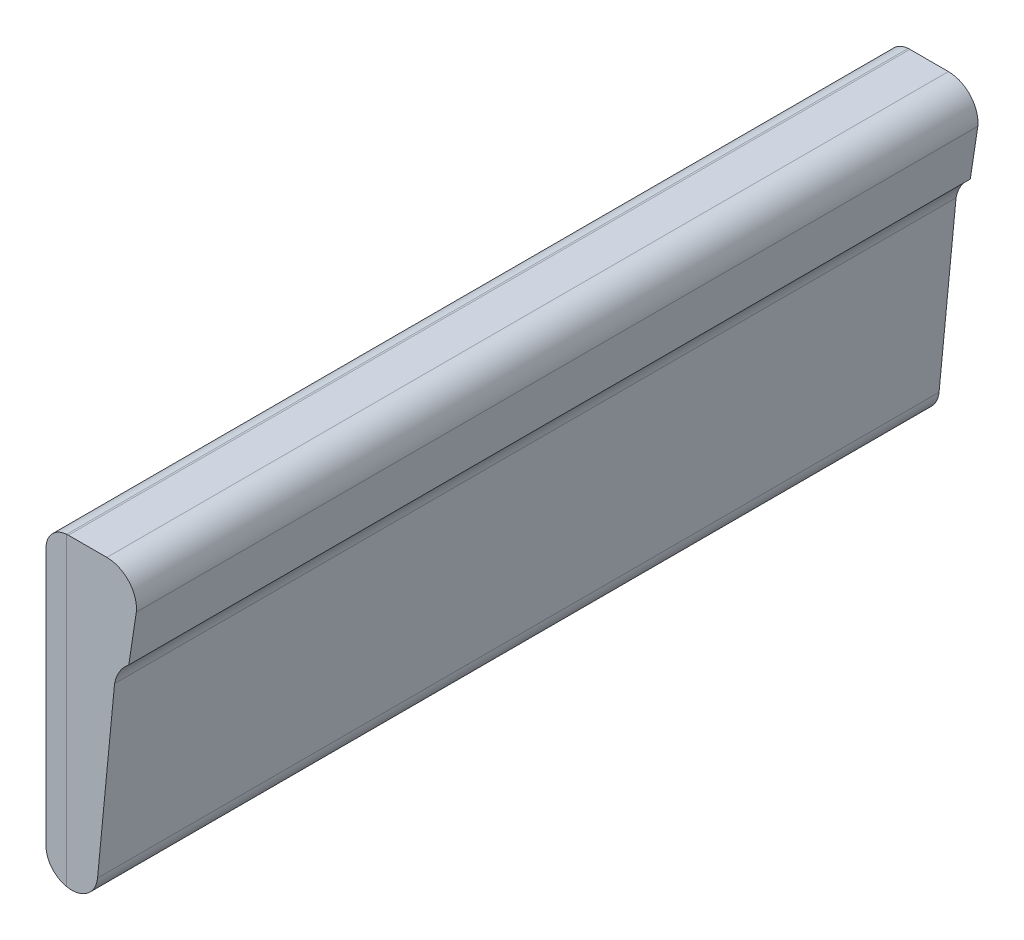
ISO-10303-21;
HEADER;
FILE_DESCRIPTION(('STEP AP214'),'2;1');
FILE_NAME('part.step','',(''),(''),'','','');
FILE_SCHEMA(('AUTOMOTIVE_DESIGN { 1 0 10303 214 1 1 1 1 }'));
ENDSEC;
DATA;
#1=APPLICATION_CONTEXT('core data for automotive mechanical design processes');
#2=APPLICATION_PROTOCOL_DEFINITION('international standard','automotive_design',2000,#1);
#3=PRODUCT_CONTEXT('',#1,'mechanical');
#4=PRODUCT('Part','Part','',(#3));
#5=PRODUCT_RELATED_PRODUCT_CATEGORY('part','',(#4));
#6=PRODUCT_DEFINITION_FORMATION('','',#4);
#7=PRODUCT_DEFINITION_CONTEXT('part definition',#1,'design');
#8=PRODUCT_DEFINITION('design','',#6,#7);
#9=PRODUCT_DEFINITION_SHAPE('','',#8);
#10=(LENGTH_UNIT() NAMED_UNIT(*) SI_UNIT(.MILLI.,.METRE.));
#11=(NAMED_UNIT(*) PLANE_ANGLE_UNIT() SI_UNIT($,.RADIAN.));
#12=(NAMED_UNIT(*) SI_UNIT($,.STERADIAN.) SOLID_ANGLE_UNIT());
#13=UNCERTAINTY_MEASURE_WITH_UNIT(LENGTH_MEASURE(1.E-05),#10,'distance_accuracy_value','');
#14=(GEOMETRIC_REPRESENTATION_CONTEXT(3) GLOBAL_UNCERTAINTY_ASSIGNED_CONTEXT((#13)) GLOBAL_UNIT_ASSIGNED_CONTEXT((#10,
#11,#12)) REPRESENTATION_CONTEXT('',''));
#15=CARTESIAN_POINT('',(0.,0.,0.));
#16=DIRECTION('',(0.,0.,1.));
#17=DIRECTION('',(1.,0.,0.));
#18=AXIS2_PLACEMENT_3D('',#15,#16,#17);
#19=CARTESIAN_POINT('',(-1.6,0.,0.));
#20=DIRECTION('',(-1.,0.,0.));
#21=DIRECTION('',(0.,0.,1.));
#22=AXIS2_PLACEMENT_3D('',#19,#20,#21);
#23=PLANE('',#22);
#24=DIRECTION('',(0.,0.,1.));
#25=VECTOR('',#24,1.);
#26=CARTESIAN_POINT('',(-1.6,-135.507524725737,-319.5));
#27=LINE('',#26,#25);
#28=CARTESIAN_POINT('',(-1.6,-135.507524725737,0.));
#29=VERTEX_POINT('',#28);
#30=CARTESIAN_POINT('',(-1.6,-135.507524725737,-319.5));
#31=VERTEX_POINT('',#30);
#32=EDGE_CURVE('E210',#29,#31,#27,.F.);
#33=ORIENTED_EDGE('',*,*,#32,.T.);
#34=DIRECTION('',(0.,1.,0.));
#35=VECTOR('',#34,1.);
#36=CARTESIAN_POINT('',(-1.6,-31.9738409369276,-319.5));
#37=LINE('',#36,#35);
#38=CARTESIAN_POINT('',(-1.6,-23.5603798711698,-319.5));
#39=VERTEX_POINT('',#38);
#40=EDGE_CURVE('E201',#31,#39,#37,.T.);
#41=ORIENTED_EDGE('',*,*,#40,.T.);
#42=DIRECTION('',(0.,0.,1.));
#43=VECTOR('',#42,1.);
#44=CARTESIAN_POINT('',(-1.6,-23.5603798711698,-319.5));
#45=LINE('',#44,#43);
#46=CARTESIAN_POINT('',(-1.6,-23.5603798711698,0.));
#47=VERTEX_POINT('',#46);
#48=EDGE_CURVE('E207',#39,#47,#45,.T.);
#49=ORIENTED_EDGE('',*,*,#48,.T.);
#50=DIRECTION('',(0.,1.,0.));
#51=VECTOR('',#50,1.);
#52=CARTESIAN_POINT('',(-1.6,-31.9738409369276,0.));
#53=LINE('',#52,#51);
#54=EDGE_CURVE('E172',#29,#47,#53,.T.);
#55=ORIENTED_EDGE('',*,*,#54,.F.);
#56=EDGE_LOOP('',(#33,#41,#49,#55));
#57=FACE_BOUND('',#56,.T.);
#58=DIRECTION('',(0.,1.,0.));
#59=VECTOR('',#58,1.);
#60=CARTESIAN_POINT('',(-1.6,-31.9738409369276,-322.5));
#61=LINE('',#60,#59);
#62=CARTESIAN_POINT('',(-1.6,-138.59646351673,-322.5));
#63=VERTEX_POINT('',#62);
#64=CARTESIAN_POINT('',(-1.6,-20.5461660795298,-322.5));
#65=VERTEX_POINT('',#64);
#66=EDGE_CURVE('E261',#63,#65,#61,.T.);
#67=ORIENTED_EDGE('',*,*,#66,.F.);
#68=DIRECTION('',(0.,0.,1.));
#69=VECTOR('',#68,1.);
#70=CARTESIAN_POINT('',(-1.6,-138.59646351673,-319.5));
#71=LINE('',#70,#69);
#72=CARTESIAN_POINT('',(-1.6,-138.59646351673,3.));
#73=VERTEX_POINT('',#72);
#74=EDGE_CURVE('E266',#73,#63,#71,.F.);
#75=ORIENTED_EDGE('',*,*,#74,.F.);
#76=DIRECTION('',(0.,1.,0.));
#77=VECTOR('',#76,1.);
#78=CARTESIAN_POINT('',(-1.6,-31.9738409369276,3.));
#79=LINE('',#78,#77);
#80=CARTESIAN_POINT('',(-1.6,-20.5461660795298,3.));
#81=VERTEX_POINT('',#80);
#82=EDGE_CURVE('E269',#73,#81,#79,.T.);
#83=ORIENTED_EDGE('',*,*,#82,.T.);
#84=DIRECTION('',(0.,0.,1.));
#85=VECTOR('',#84,1.);
#86=CARTESIAN_POINT('',(-1.6,-20.5461660795298,-319.5));
#87=LINE('',#86,#85);
#88=EDGE_CURVE('E263',#65,#81,#87,.T.);
#89=ORIENTED_EDGE('',*,*,#88,.F.);
#90=EDGE_LOOP('',(#67,#75,#83,#89));
#91=FACE_BOUND('',#90,.T.);
#92=ADVANCED_FACE('F53',(#57,#91),#23,.T.);
#93=CARTESIAN_POINT('',(7.37051113694931,-129.458687531729,-319.5));
#94=DIRECTION('',(0.995409041424573,-0.0957122784715338,0.));
#95=DIRECTION('',(0.0957122784715339,0.995409041424573,0.));
#96=AXIS2_PLACEMENT_3D('',#93,#94,#95);
#97=PLANE('',#96);
#98=DIRECTION('',(0.0957122784715338,0.995409041424573,0.));
#99=VECTOR('',#98,1.);
#100=CARTESIAN_POINT('',(7.37051113694931,-129.458687531729,0.));
#101=LINE('',#100,#99);
#102=CARTESIAN_POINT('',(7.37051113694931,-129.458687531729,0.));
#103=VERTEX_POINT('',#102);
#104=CARTESIAN_POINT('',(13.962836945943,-60.8984064572317,0.));
#105=VERTEX_POINT('',#104);
#106=EDGE_CURVE('E218',#103,#105,#101,.T.);
#107=ORIENTED_EDGE('',*,*,#106,.T.);
#108=DIRECTION('',(0.,0.,1.));
#109=VECTOR('',#108,1.);
#110=CARTESIAN_POINT('',(13.962836945943,-60.8984064572317,-319.5));
#111=LINE('',#110,#109);
#112=CARTESIAN_POINT('',(13.962836945943,-60.8984064572317,-319.5));
#113=VERTEX_POINT('',#112);
#114=EDGE_CURVE('E223',#113,#105,#111,.T.);
#115=ORIENTED_EDGE('',*,*,#114,.F.);
#116=DIRECTION('',(0.0957122784715338,0.995409041424573,0.));
#117=VECTOR('',#116,1.);
#118=CARTESIAN_POINT('',(7.37051113694931,-129.458687531729,-319.5));
#119=LINE('',#118,#117);
#120=CARTESIAN_POINT('',(7.37051113694931,-129.458687531729,-319.5));
#121=VERTEX_POINT('',#120);
#122=EDGE_CURVE('E484',#121,#113,#119,.T.);
#123=ORIENTED_EDGE('',*,*,#122,.F.);
#124=DIRECTION('',(0.,0.,1.));
#125=VECTOR('',#124,1.);
#126=CARTESIAN_POINT('',(7.37051113694931,-129.458687531729,-319.5));
#127=LINE('',#126,#125);
#128=EDGE_CURVE('E205',#121,#103,#127,.T.);
#129=ORIENTED_EDGE('',*,*,#128,.T.);
#130=EDGE_LOOP('',(#107,#115,#123,#129));
#131=FACE_BOUND('',#130,.T.);
#132=ADVANCED_FACE('F304',(#131),#97,.F.);
#133=CARTESIAN_POINT('',(31.4667033179905,-64.0199701793683,-319.5));
#134=DIRECTION('',(0.,0.,1.));
#135=DIRECTION('',(1.,0.,0.));
#136=AXIS2_PLACEMENT_3D('',#133,#134,#135);
#137=CYLINDRICAL_SURFACE('',#136,17.7800308785405);
#138=CARTESIAN_POINT('',(31.4667033179905,-64.0199701793683,0.));
#139=DIRECTION('',(0.,0.,-1.));
#140=DIRECTION('',(1.,0.,0.));
#141=AXIS2_PLACEMENT_3D('',#138,#139,#140);
#142=CIRCLE('',#141,17.7800308785405);
#143=CARTESIAN_POINT('',(19.6303268731132,-50.7523520548891,0.));
#144=VERTEX_POINT('',#143);
#145=EDGE_CURVE('E468',#105,#144,#142,.T.);
#146=ORIENTED_EDGE('',*,*,#145,.T.);
#147=DIRECTION('',(0.,0.,1.));
#148=VECTOR('',#147,1.);
#149=CARTESIAN_POINT('',(19.6303268731132,-50.7523520548891,-319.5));
#150=LINE('',#149,#148);
#151=CARTESIAN_POINT('',(19.6303268731132,-50.7523520548891,-319.5));
#152=VERTEX_POINT('',#151);
#153=EDGE_CURVE('E472',#152,#144,#150,.T.);
#154=ORIENTED_EDGE('',*,*,#153,.F.);
#155=CARTESIAN_POINT('',(31.4667033179905,-64.0199701793683,-319.5));
#156=DIRECTION('',(0.,0.,-1.));
#157=DIRECTION('',(1.,0.,0.));
#158=AXIS2_PLACEMENT_3D('',#155,#156,#157);
#159=CIRCLE('',#158,17.7800308785405);
#160=EDGE_CURVE('E476',#113,#152,#159,.T.);
#161=ORIENTED_EDGE('',*,*,#160,.F.);
#162=ORIENTED_EDGE('',*,*,#114,.T.);
#163=EDGE_LOOP('',(#146,#154,#161,#162));
#164=FACE_BOUND('',#163,.T.);
#165=ADVANCED_FACE('F306',(#164),#137,.T.);
#166=CARTESIAN_POINT('',(22.3782166070811,-32.7853807174074,-319.5));
#167=DIRECTION('',(0.988505756164447,-0.151183233295742,0.));
#168=DIRECTION('',(0.151183233295742,0.988505756164447,0.));
#169=AXIS2_PLACEMENT_3D('',#166,#167,#168);
#170=PLANE('',#169);
#171=DIRECTION('',(0.151183233295742,0.988505756164447,0.));
#172=VECTOR('',#171,1.);
#173=CARTESIAN_POINT('',(22.3782166070811,-32.7853807174074,0.));
#174=LINE('',#173,#172);
#175=CARTESIAN_POINT('',(22.3782166070811,-32.7853807174074,0.));
#176=VERTEX_POINT('',#175);
#177=EDGE_CURVE('E260',#144,#176,#174,.T.);
#178=ORIENTED_EDGE('',*,*,#177,.T.);
#179=DIRECTION('',(0.,0.,1.));
#180=VECTOR('',#179,1.);
#181=CARTESIAN_POINT('',(22.3782166070811,-32.7853807174074,-319.5));
#182=LINE('',#181,#180);
#183=CARTESIAN_POINT('',(22.3782166070811,-32.7853807174074,-319.5));
#184=VERTEX_POINT('',#183);
#185=EDGE_CURVE('E126',#184,#176,#182,.T.);
#186=ORIENTED_EDGE('',*,*,#185,.F.);
#187=DIRECTION('',(0.151183233295742,0.988505756164447,0.));
#188=VECTOR('',#187,1.);
#189=CARTESIAN_POINT('',(22.3782166070811,-32.7853807174074,-319.5));
#190=LINE('',#189,#188);
#191=EDGE_CURVE('E475',#152,#184,#190,.T.);
#192=ORIENTED_EDGE('',*,*,#191,.F.);
#193=ORIENTED_EDGE('',*,*,#153,.T.);
#194=EDGE_LOOP('',(#178,#186,#192,#193));
#195=FACE_BOUND('',#194,.T.);
#196=ADVANCED_FACE('F313',(#195),#170,.F.);
#197=CARTESIAN_POINT('',(13.962836945943,-31.9738409369276,-319.5));
#198=DIRECTION('',(0.,0.,1.));
#199=DIRECTION('',(1.,0.,0.));
#200=AXIS2_PLACEMENT_3D('',#197,#198,#199);
#201=CYLINDRICAL_SURFACE('',#200,8.45441965225271);
#202=CARTESIAN_POINT('',(13.962836945943,-31.9738409369276,0.));
#203=DIRECTION('',(0.,0.,1.));
#204=DIRECTION('',(-1.,0.,0.));
#205=AXIS2_PLACEMENT_3D('',#202,#203,#204);
#206=CIRCLE('',#205,8.45441965225271);
#207=CARTESIAN_POINT('',(13.962836945943,-23.5194212846748,0.));
#208=VERTEX_POINT('',#207);
#209=EDGE_CURVE('E463',#176,#208,#206,.T.);
#210=ORIENTED_EDGE('',*,*,#209,.T.);
#211=DIRECTION('',(0.,0.,1.));
#212=VECTOR('',#211,1.);
#213=CARTESIAN_POINT('',(13.962836945943,-23.5194212846748,-319.5));
#214=LINE('',#213,#212);
#215=CARTESIAN_POINT('',(13.962836945943,-23.5194212846748,-319.5));
#216=VERTEX_POINT('',#215);
#217=EDGE_CURVE('E460',#216,#208,#214,.T.);
#218=ORIENTED_EDGE('',*,*,#217,.F.);
#219=CARTESIAN_POINT('',(13.962836945943,-31.9738409369276,-319.5));
#220=DIRECTION('',(0.,0.,1.));
#221=DIRECTION('',(-1.,0.,0.));
#222=AXIS2_PLACEMENT_3D('',#219,#220,#221);
#223=CIRCLE('',#222,8.45441965225271);
#224=EDGE_CURVE('E257',#184,#216,#223,.T.);
#225=ORIENTED_EDGE('',*,*,#224,.F.);
#226=ORIENTED_EDGE('',*,*,#185,.T.);
#227=EDGE_LOOP('',(#210,#218,#225,#226));
#228=FACE_BOUND('',#227,.T.);
#229=ADVANCED_FACE('F323',(#228),#201,.F.);
#230=CARTESIAN_POINT('',(13.962836945943,-23.5194212846748,-319.5));
#231=DIRECTION('',(0.,1.,0.));
#232=DIRECTION('',(0.,0.,1.));
#233=AXIS2_PLACEMENT_3D('',#230,#231,#232);
#234=PLANE('',#233);
#235=DIRECTION('',(-1.,0.,0.));
#236=VECTOR('',#235,1.);
#237=CARTESIAN_POINT('',(13.962836945943,-23.5194212846748,0.));
#238=LINE('',#237,#236);
#239=CARTESIAN_POINT('',(-0.919188983830335,-23.5194212846748,0.));
#240=VERTEX_POINT('',#239);
#241=EDGE_CURVE('E219',#208,#240,#238,.T.);
#242=ORIENTED_EDGE('',*,*,#241,.T.);
#243=DIRECTION('',(0.,0.,1.));
#244=VECTOR('',#243,1.);
#245=CARTESIAN_POINT('',(-0.919188983830335,-23.5194212846748,-319.5));
#246=LINE('',#245,#244);
#247=CARTESIAN_POINT('',(-0.919188983830335,-23.5194212846748,-319.5));
#248=VERTEX_POINT('',#247);
#249=EDGE_CURVE('E164',#248,#240,#246,.T.);
#250=ORIENTED_EDGE('',*,*,#249,.F.);
#251=DIRECTION('',(-1.,0.,0.));
#252=VECTOR('',#251,1.);
#253=CARTESIAN_POINT('',(13.962836945943,-23.5194212846748,-319.5));
#254=LINE('',#253,#252);
#255=EDGE_CURVE('E204',#216,#248,#254,.T.);
#256=ORIENTED_EDGE('',*,*,#255,.F.);
#257=ORIENTED_EDGE('',*,*,#217,.T.);
#258=EDGE_LOOP('',(#242,#250,#256,#257));
#259=FACE_BOUND('',#258,.T.);
#260=ADVANCED_FACE('F319',(#259),#234,.F.);
#261=CARTESIAN_POINT('',(-0.919188983830335,-29.1980992537325,-319.5));
#262=DIRECTION('',(0.,0.,1.));
#263=DIRECTION('',(1.,0.,0.));
#264=AXIS2_PLACEMENT_3D('',#261,#262,#263);
#265=CYLINDRICAL_SURFACE('',#264,5.67867796905766);
#266=ORIENTED_EDGE('',*,*,#48,.F.);
#267=CARTESIAN_POINT('',(-0.919188983830335,-29.1980992537325,-319.5));
#268=DIRECTION('',(0.,0.,1.));
#269=DIRECTION('',(1.,0.,0.));
#270=AXIS2_PLACEMENT_3D('',#267,#268,#269);
#271=CIRCLE('',#270,5.67867796905766);
#272=EDGE_CURVE('E197',#248,#39,#271,.T.);
#273=ORIENTED_EDGE('',*,*,#272,.F.);
#274=ORIENTED_EDGE('',*,*,#249,.T.);
#275=CARTESIAN_POINT('',(-0.919188983830335,-29.1980992537325,0.));
#276=DIRECTION('',(0.,0.,1.));
#277=DIRECTION('',(1.,0.,0.));
#278=AXIS2_PLACEMENT_3D('',#275,#276,#277);
#279=CIRCLE('',#278,5.67867796905766);
#280=EDGE_CURVE('E209',#240,#47,#279,.T.);
#281=ORIENTED_EDGE('',*,*,#280,.T.);
#282=EDGE_LOOP('',(#266,#273,#274,#281));
#283=FACE_BOUND('',#282,.T.);
#284=ADVANCED_FACE('F208',(#283),#265,.F.);
#285=CARTESIAN_POINT('',(0.393517748956527,-128.787823689574,-319.5));
#286=DIRECTION('',(0.,0.,1.));
#287=DIRECTION('',(1.,0.,0.));
#288=AXIS2_PLACEMENT_3D('',#285,#286,#287);
#289=CYLINDRICAL_SURFACE('',#288,7.00917220724427);
#290=ORIENTED_EDGE('',*,*,#32,.F.);
#291=CARTESIAN_POINT('',(0.393517748956527,-128.787823689574,0.));
#292=DIRECTION('',(0.,0.,1.));
#293=DIRECTION('',(-1.,0.,0.));
#294=AXIS2_PLACEMENT_3D('',#291,#292,#293);
#295=CIRCLE('',#294,7.00917220724427);
#296=EDGE_CURVE('E216',#29,#103,#295,.T.);
#297=ORIENTED_EDGE('',*,*,#296,.T.);
#298=ORIENTED_EDGE('',*,*,#128,.F.);
#299=CARTESIAN_POINT('',(0.393517748956527,-128.787823689574,-319.5));
#300=DIRECTION('',(0.,0.,1.));
#301=DIRECTION('',(-1.,0.,0.));
#302=AXIS2_PLACEMENT_3D('',#299,#300,#301);
#303=CIRCLE('',#302,7.00917220724427);
#304=EDGE_CURVE('E221',#31,#121,#303,.T.);
#305=ORIENTED_EDGE('',*,*,#304,.F.);
#306=EDGE_LOOP('',(#290,#297,#298,#305));
#307=FACE_BOUND('',#306,.T.);
#308=ADVANCED_FACE('F407',(#307),#289,.F.);
#309=CARTESIAN_POINT('',(13.962836945943,-31.9738409369276,0.));
#310=DIRECTION('',(0.,0.,-1.));
#311=DIRECTION('',(-1.,0.,0.));
#312=AXIS2_PLACEMENT_3D('',#309,#310,#311);
#313=PLANE('',#312);
#314=ORIENTED_EDGE('',*,*,#296,.F.);
#315=ORIENTED_EDGE('',*,*,#54,.T.);
#316=ORIENTED_EDGE('',*,*,#280,.F.);
#317=ORIENTED_EDGE('',*,*,#241,.F.);
#318=ORIENTED_EDGE('',*,*,#209,.F.);
#319=ORIENTED_EDGE('',*,*,#177,.F.);
#320=ORIENTED_EDGE('',*,*,#145,.F.);
#321=ORIENTED_EDGE('',*,*,#106,.F.);
#322=EDGE_LOOP('',(#314,#315,#316,#317,#318,#319,#320,#321));
#323=FACE_BOUND('',#322,.T.);
#324=ADVANCED_FACE('F398',(#323),#313,.T.);
#325=CARTESIAN_POINT('',(13.962836945943,-31.9738409369276,-319.5));
#326=DIRECTION('',(0.,0.,-1.));
#327=DIRECTION('',(-1.,0.,0.));
#328=AXIS2_PLACEMENT_3D('',#325,#326,#327);
#329=PLANE('',#328);
#330=ORIENTED_EDGE('',*,*,#40,.F.);
#331=ORIENTED_EDGE('',*,*,#304,.T.);
#332=ORIENTED_EDGE('',*,*,#122,.T.);
#333=ORIENTED_EDGE('',*,*,#160,.T.);
#334=ORIENTED_EDGE('',*,*,#191,.T.);
#335=ORIENTED_EDGE('',*,*,#224,.T.);
#336=ORIENTED_EDGE('',*,*,#255,.T.);
#337=ORIENTED_EDGE('',*,*,#272,.T.);
#338=EDGE_LOOP('',(#330,#331,#332,#333,#334,#335,#336,#337));
#339=FACE_BOUND('',#338,.T.);
#340=ADVANCED_FACE('F199',(#339),#329,.F.);
#341=CARTESIAN_POINT('',(0.393517748956527,-128.787823689574,-319.5));
#342=DIRECTION('',(0.,0.,1.));
#343=DIRECTION('',(1.,0.,0.));
#344=AXIS2_PLACEMENT_3D('',#341,#342,#343);
#345=CYLINDRICAL_SURFACE('',#344,10.0091722072443);
#346=CARTESIAN_POINT('',(0.393517748956527,-128.787823689574,3.));
#347=DIRECTION('',(0.,0.,-1.));
#348=DIRECTION('',(-1.,0.,0.));
#349=AXIS2_PLACEMENT_3D('',#346,#347,#348);
#350=CIRCLE('',#349,10.0091722072443);
#351=CARTESIAN_POINT('',(10.356738261223,-129.745824367144,3.));
#352=VERTEX_POINT('',#351);
#353=EDGE_CURVE('E229',#73,#352,#350,.F.);
#354=ORIENTED_EDGE('',*,*,#353,.F.);
#355=ORIENTED_EDGE('',*,*,#74,.T.);
#356=CARTESIAN_POINT('',(0.393517748956527,-128.787823689574,-322.5));
#357=DIRECTION('',(0.,0.,-1.));
#358=DIRECTION('',(-1.,0.,0.));
#359=AXIS2_PLACEMENT_3D('',#356,#357,#358);
#360=CIRCLE('',#359,10.0091722072443);
#361=CARTESIAN_POINT('',(10.356738261223,-129.745824367144,-322.5));
#362=VERTEX_POINT('',#361);
#363=EDGE_CURVE('E224',#63,#362,#360,.F.);
#364=ORIENTED_EDGE('',*,*,#363,.T.);
#365=DIRECTION('',(0.,0.,1.));
#366=VECTOR('',#365,1.);
#367=CARTESIAN_POINT('',(10.356738261223,-129.745824367144,-319.5));
#368=LINE('',#367,#366);
#369=EDGE_CURVE('E243',#362,#352,#368,.T.);
#370=ORIENTED_EDGE('',*,*,#369,.T.);
#371=EDGE_LOOP('',(#354,#355,#364,#370));
#372=FACE_BOUND('',#371,.T.);
#373=ADVANCED_FACE('F380',(#372),#345,.T.);
#374=CARTESIAN_POINT('',(-0.919188983830335,-29.1980992537325,-319.5));
#375=DIRECTION('',(0.,0.,1.));
#376=DIRECTION('',(1.,0.,0.));
#377=AXIS2_PLACEMENT_3D('',#374,#375,#376);
#378=CYLINDRICAL_SURFACE('',#377,8.67867796905766);
#379=CARTESIAN_POINT('',(-0.919188983830335,-29.1980992537325,-322.5));
#380=DIRECTION('',(0.,0.,-1.));
#381=DIRECTION('',(-1.,0.,0.));
#382=AXIS2_PLACEMENT_3D('',#379,#380,#381);
#383=CIRCLE('',#382,8.67867796905766);
#384=CARTESIAN_POINT('',(-0.919188983830335,-20.5194212846748,-322.5));
#385=VERTEX_POINT('',#384);
#386=EDGE_CURVE('E226',#385,#65,#383,.F.);
#387=ORIENTED_EDGE('',*,*,#386,.T.);
#388=ORIENTED_EDGE('',*,*,#88,.T.);
#389=CARTESIAN_POINT('',(-0.919188983830335,-29.1980992537325,3.));
#390=DIRECTION('',(0.,0.,-1.));
#391=DIRECTION('',(-1.,0.,0.));
#392=AXIS2_PLACEMENT_3D('',#389,#390,#391);
#393=CIRCLE('',#392,8.67867796905766);
#394=CARTESIAN_POINT('',(-0.919188983830335,-20.5194212846748,3.));
#395=VERTEX_POINT('',#394);
#396=EDGE_CURVE('E57',#395,#81,#393,.F.);
#397=ORIENTED_EDGE('',*,*,#396,.F.);
#398=DIRECTION('',(0.,0.,1.));
#399=VECTOR('',#398,1.);
#400=CARTESIAN_POINT('',(-0.919188983830335,-20.5194212846748,-319.5));
#401=LINE('',#400,#399);
#402=EDGE_CURVE('E101',#385,#395,#401,.T.);
#403=ORIENTED_EDGE('',*,*,#402,.F.);
#404=EDGE_LOOP('',(#387,#388,#397,#403));
#405=FACE_BOUND('',#404,.T.);
#406=ADVANCED_FACE('F275',(#405),#378,.T.);
#407=CARTESIAN_POINT('',(13.962836945943,-31.9738409369276,-322.5));
#408=DIRECTION('',(0.,0.,-1.));
#409=DIRECTION('',(-1.,0.,0.));
#410=AXIS2_PLACEMENT_3D('',#407,#408,#409);
#411=PLANE('',#410);
#412=ORIENTED_EDGE('',*,*,#363,.F.);
#413=ORIENTED_EDGE('',*,*,#66,.T.);
#414=ORIENTED_EDGE('',*,*,#386,.F.);
#415=DIRECTION('',(-1.,0.,0.));
#416=VECTOR('',#415,1.);
#417=CARTESIAN_POINT('',(13.962836945943,-20.5194212846748,-322.5));
#418=LINE('',#417,#416);
#419=CARTESIAN_POINT('',(13.962836945943,-20.5194212846748,-322.5));
#420=VERTEX_POINT('',#419);
#421=EDGE_CURVE('E228',#420,#385,#418,.T.);
#422=ORIENTED_EDGE('',*,*,#421,.F.);
#423=CARTESIAN_POINT('',(13.962836945943,-31.9738409369276,-322.5));
#424=DIRECTION('',(0.,0.,-1.));
#425=DIRECTION('',(-1.,0.,0.));
#426=AXIS2_PLACEMENT_3D('',#423,#424,#425);
#427=CIRCLE('',#426,11.4544196522527);
#428=CARTESIAN_POINT('',(25.3553951783093,-33.1626834378744,-322.5));
#429=VERTEX_POINT('',#428);
#430=EDGE_CURVE('E254',#429,#420,#427,.F.);
#431=ORIENTED_EDGE('',*,*,#430,.F.);
#432=DIRECTION('',(0.151183233295742,0.988505756164447,0.));
#433=VECTOR('',#432,1.);
#434=CARTESIAN_POINT('',(25.3437338755744,-33.2389304172947,-322.5));
#435=LINE('',#434,#433);
#436=CARTESIAN_POINT('',(22.4240867341361,-52.328930957468,-322.5));
#437=VERTEX_POINT('',#436);
#438=EDGE_CURVE('E247',#437,#429,#435,.T.);
#439=ORIENTED_EDGE('',*,*,#438,.F.);
#440=CARTESIAN_POINT('',(31.4667033179905,-64.0199701793683,-322.5));
#441=DIRECTION('',(0.,0.,-1.));
#442=DIRECTION('',(-1.,0.,0.));
#443=AXIS2_PLACEMENT_3D('',#440,#441,#442);
#444=CIRCLE('',#443,14.7800308785405);
#445=CARTESIAN_POINT('',(16.9369475056105,-61.3115557348601,-322.5));
#446=VERTEX_POINT('',#445);
#447=EDGE_CURVE('E245',#446,#437,#444,.T.);
#448=ORIENTED_EDGE('',*,*,#447,.F.);
#449=DIRECTION('',(0.0957122784715339,0.995409041424573,0.));
#450=VECTOR('',#449,1.);
#451=CARTESIAN_POINT('',(10.356738261223,-129.745824367144,-322.5));
#452=LINE('',#451,#450);
#453=EDGE_CURVE('E227',#362,#446,#452,.T.);
#454=ORIENTED_EDGE('',*,*,#453,.F.);
#455=EDGE_LOOP('',(#412,#413,#414,#422,#431,#439,#448,#454));
#456=FACE_BOUND('',#455,.T.);
#457=ADVANCED_FACE('F55',(#456),#411,.T.);
#458=CARTESIAN_POINT('',(13.962836945943,-31.9738409369276,3.));
#459=DIRECTION('',(0.,0.,-1.));
#460=DIRECTION('',(-1.,0.,0.));
#461=AXIS2_PLACEMENT_3D('',#458,#459,#460);
#462=PLANE('',#461);
#463=ORIENTED_EDGE('',*,*,#82,.F.);
#464=ORIENTED_EDGE('',*,*,#353,.T.);
#465=DIRECTION('',(0.0957122784715339,0.995409041424573,0.));
#466=VECTOR('',#465,1.);
#467=CARTESIAN_POINT('',(10.356738261223,-129.745824367144,3.));
#468=LINE('',#467,#466);
#469=CARTESIAN_POINT('',(16.9369475056105,-61.3115557348601,3.));
#470=VERTEX_POINT('',#469);
#471=EDGE_CURVE('E230',#352,#470,#468,.T.);
#472=ORIENTED_EDGE('',*,*,#471,.T.);
#473=CARTESIAN_POINT('',(31.4667033179905,-64.0199701793683,3.));
#474=DIRECTION('',(0.,0.,-1.));
#475=DIRECTION('',(-1.,0.,0.));
#476=AXIS2_PLACEMENT_3D('',#473,#474,#475);
#477=CIRCLE('',#476,14.7800308785405);
#478=CARTESIAN_POINT('',(22.4240867341361,-52.328930957468,3.));
#479=VERTEX_POINT('',#478);
#480=EDGE_CURVE('E235',#470,#479,#477,.T.);
#481=ORIENTED_EDGE('',*,*,#480,.T.);
#482=DIRECTION('',(0.151183233295742,0.988505756164447,0.));
#483=VECTOR('',#482,1.);
#484=CARTESIAN_POINT('',(25.3437338755744,-33.2389304172947,3.));
#485=LINE('',#484,#483);
#486=CARTESIAN_POINT('',(25.3553951783093,-33.1626834378744,3.));
#487=VERTEX_POINT('',#486);
#488=EDGE_CURVE('E239',#479,#487,#485,.T.);
#489=ORIENTED_EDGE('',*,*,#488,.T.);
#490=CARTESIAN_POINT('',(13.962836945943,-31.9738409369276,3.));
#491=DIRECTION('',(0.,0.,-1.));
#492=DIRECTION('',(-1.,0.,0.));
#493=AXIS2_PLACEMENT_3D('',#490,#491,#492);
#494=CIRCLE('',#493,11.4544196522527);
#495=CARTESIAN_POINT('',(13.962836945943,-20.5194212846748,3.));
#496=VERTEX_POINT('',#495);
#497=EDGE_CURVE('E12',#487,#496,#494,.F.);
#498=ORIENTED_EDGE('',*,*,#497,.T.);
#499=DIRECTION('',(-1.,0.,0.));
#500=VECTOR('',#499,1.);
#501=CARTESIAN_POINT('',(13.962836945943,-20.5194212846748,3.));
#502=LINE('',#501,#500);
#503=EDGE_CURVE('E63',#496,#395,#502,.T.);
#504=ORIENTED_EDGE('',*,*,#503,.T.);
#505=ORIENTED_EDGE('',*,*,#396,.T.);
#506=EDGE_LOOP('',(#463,#464,#472,#481,#489,#498,#504,#505));
#507=FACE_BOUND('',#506,.T.);
#508=ADVANCED_FACE('F273',(#507),#462,.F.);
#509=CARTESIAN_POINT('',(13.962836945943,-31.9738409369276,-319.5));
#510=DIRECTION('',(0.,0.,1.));
#511=DIRECTION('',(1.,0.,0.));
#512=AXIS2_PLACEMENT_3D('',#509,#510,#511);
#513=CYLINDRICAL_SURFACE('',#512,11.4544196522527);
#514=ORIENTED_EDGE('',*,*,#497,.F.);
#515=DIRECTION('',(0.,0.,1.));
#516=VECTOR('',#515,1.);
#517=CARTESIAN_POINT('',(25.3553951783093,-33.1626834378744,-322.5));
#518=LINE('',#517,#516);
#519=EDGE_CURVE('E87',#429,#487,#518,.T.);
#520=ORIENTED_EDGE('',*,*,#519,.F.);
#521=ORIENTED_EDGE('',*,*,#430,.T.);
#522=DIRECTION('',(0.,0.,1.));
#523=VECTOR('',#522,1.);
#524=CARTESIAN_POINT('',(13.962836945943,-20.5194212846748,-319.5));
#525=LINE('',#524,#523);
#526=EDGE_CURVE('E72',#420,#496,#525,.T.);
#527=ORIENTED_EDGE('',*,*,#526,.T.);
#528=EDGE_LOOP('',(#514,#520,#521,#527));
#529=FACE_BOUND('',#528,.T.);
#530=ADVANCED_FACE('F296',(#529),#513,.T.);
#531=CARTESIAN_POINT('',(25.3437338755744,-33.2389304172947,-319.5));
#532=DIRECTION('',(0.988505756164447,-0.151183233295742,0.));
#533=DIRECTION('',(0.151183233295742,0.988505756164447,0.));
#534=AXIS2_PLACEMENT_3D('',#531,#532,#533);
#535=PLANE('',#534);
#536=ORIENTED_EDGE('',*,*,#488,.F.);
#537=DIRECTION('',(0.,0.,1.));
#538=VECTOR('',#537,1.);
#539=CARTESIAN_POINT('',(22.4240867341361,-52.328930957468,-322.5));
#540=LINE('',#539,#538);
#541=EDGE_CURVE('E115',#437,#479,#540,.T.);
#542=ORIENTED_EDGE('',*,*,#541,.F.);
#543=ORIENTED_EDGE('',*,*,#438,.T.);
#544=ORIENTED_EDGE('',*,*,#519,.T.);
#545=EDGE_LOOP('',(#536,#542,#543,#544));
#546=FACE_BOUND('',#545,.T.);
#547=ADVANCED_FACE('F294',(#546),#535,.T.);
#548=CARTESIAN_POINT('',(31.4667033179905,-64.0199701793683,-319.5));
#549=DIRECTION('',(0.,0.,1.));
#550=DIRECTION('',(1.,0.,0.));
#551=AXIS2_PLACEMENT_3D('',#548,#549,#550);
#552=CYLINDRICAL_SURFACE('',#551,14.7800308785405);
#553=ORIENTED_EDGE('',*,*,#480,.F.);
#554=DIRECTION('',(0.,0.,1.));
#555=VECTOR('',#554,1.);
#556=CARTESIAN_POINT('',(16.9369475056105,-61.3115557348601,-322.5));
#557=LINE('',#556,#555);
#558=EDGE_CURVE('E248',#446,#470,#557,.T.);
#559=ORIENTED_EDGE('',*,*,#558,.F.);
#560=ORIENTED_EDGE('',*,*,#447,.T.);
#561=ORIENTED_EDGE('',*,*,#541,.T.);
#562=EDGE_LOOP('',(#553,#559,#560,#561));
#563=FACE_BOUND('',#562,.T.);
#564=ADVANCED_FACE('F293',(#563),#552,.F.);
#565=CARTESIAN_POINT('',(10.356738261223,-129.745824367144,-319.5));
#566=DIRECTION('',(0.995409041424573,-0.0957122784715338,0.));
#567=DIRECTION('',(0.0957122784715339,0.995409041424573,0.));
#568=AXIS2_PLACEMENT_3D('',#565,#566,#567);
#569=PLANE('',#568);
#570=ORIENTED_EDGE('',*,*,#471,.F.);
#571=ORIENTED_EDGE('',*,*,#369,.F.);
#572=ORIENTED_EDGE('',*,*,#453,.T.);
#573=ORIENTED_EDGE('',*,*,#558,.T.);
#574=EDGE_LOOP('',(#570,#571,#572,#573));
#575=FACE_BOUND('',#574,.T.);
#576=ADVANCED_FACE('F288',(#575),#569,.T.);
#577=CARTESIAN_POINT('',(13.962836945943,-20.5194212846748,-319.5));
#578=DIRECTION('',(0.,1.,0.));
#579=DIRECTION('',(0.,0.,1.));
#580=AXIS2_PLACEMENT_3D('',#577,#578,#579);
#581=PLANE('',#580);
#582=ORIENTED_EDGE('',*,*,#503,.F.);
#583=ORIENTED_EDGE('',*,*,#526,.F.);
#584=ORIENTED_EDGE('',*,*,#421,.T.);
#585=ORIENTED_EDGE('',*,*,#402,.T.);
#586=EDGE_LOOP('',(#582,#583,#584,#585));
#587=FACE_BOUND('',#586,.T.);
#588=ADVANCED_FACE('F278',(#587),#581,.T.);
#589=CLOSED_SHELL('',(#92,#132,#165,#196,#229,#260,#284,#308,#324,#340,#373,#406,#457,#508,#530,
#547,#564,#576,#588));
#590=MANIFOLD_SOLID_BREP('B2',#589);
#591=CARTESIAN_POINT('',(-1.6,0.,0.));
#592=DIRECTION('',(-1.,0.,0.));
#593=DIRECTION('',(0.,0.,1.));
#594=AXIS2_PLACEMENT_3D('',#591,#592,#593);
#595=PLANE('',#594);
#596=DIRECTION('',(0.,1.,0.));
#597=VECTOR('',#596,1.);
#598=CARTESIAN_POINT('',(-1.6,-31.9738409369276,-322.5));
#599=LINE('',#598,#597);
#600=CARTESIAN_POINT('',(-1.6,-138.59646351673,-322.5));
#601=VERTEX_POINT('',#600);
#602=CARTESIAN_POINT('',(-1.6,-20.5461660795298,-322.5));
#603=VERTEX_POINT('',#602);
#604=EDGE_CURVE('E501',#601,#603,#599,.T.);
#605=ORIENTED_EDGE('',*,*,#604,.T.);
#606=DIRECTION('',(0.,0.,1.));
#607=VECTOR('',#606,1.);
#608=CARTESIAN_POINT('',(-1.6,-20.5461660795298,-319.5));
#609=LINE('',#608,#607);
#610=CARTESIAN_POINT('',(-1.6,-20.5461660795298,3.));
#611=VERTEX_POINT('',#610);
#612=EDGE_CURVE('E625',#603,#611,#609,.T.);
#613=ORIENTED_EDGE('',*,*,#612,.T.);
#614=DIRECTION('',(0.,1.,0.));
#615=VECTOR('',#614,1.);
#616=CARTESIAN_POINT('',(-1.6,-31.9738409369276,3.));
#617=LINE('',#616,#615);
#618=CARTESIAN_POINT('',(-1.6,-138.59646351673,3.));
#619=VERTEX_POINT('',#618);
#620=EDGE_CURVE('E621',#619,#611,#617,.T.);
#621=ORIENTED_EDGE('',*,*,#620,.F.);
#622=DIRECTION('',(0.,0.,1.));
#623=VECTOR('',#622,1.);
#624=CARTESIAN_POINT('',(-1.6,-138.59646351673,-319.5));
#625=LINE('',#624,#623);
#626=EDGE_CURVE('E624',#619,#601,#625,.F.);
#627=ORIENTED_EDGE('',*,*,#626,.T.);
#628=EDGE_LOOP('',(#605,#613,#621,#627));
#629=FACE_BOUND('',#628,.T.);
#630=DIRECTION('',(0.,0.,1.));
#631=VECTOR('',#630,1.);
#632=CARTESIAN_POINT('',(-1.6,-135.507524725737,-319.5));
#633=LINE('',#632,#631);
#634=CARTESIAN_POINT('',(-1.6,-135.507524725737,0.));
#635=VERTEX_POINT('',#634);
#636=CARTESIAN_POINT('',(-1.6,-135.507524725737,-319.5));
#637=VERTEX_POINT('',#636);
#638=EDGE_CURVE('E618',#635,#637,#633,.F.);
#639=ORIENTED_EDGE('',*,*,#638,.F.);
#640=DIRECTION('',(0.,1.,0.));
#641=VECTOR('',#640,1.);
#642=CARTESIAN_POINT('',(-1.6,-31.9738409369276,0.));
#643=LINE('',#642,#641);
#644=CARTESIAN_POINT('',(-1.6,-23.5603798711698,0.));
#645=VERTEX_POINT('',#644);
#646=EDGE_CURVE('E51',#635,#645,#643,.T.);
#647=ORIENTED_EDGE('',*,*,#646,.T.);
#648=DIRECTION('',(0.,0.,1.));
#649=VECTOR('',#648,1.);
#650=CARTESIAN_POINT('',(-1.6,-23.5603798711698,-319.5));
#651=LINE('',#650,#649);
#652=CARTESIAN_POINT('',(-1.6,-23.5603798711698,-319.5));
#653=VERTEX_POINT('',#652);
#654=EDGE_CURVE('E519',#653,#645,#651,.T.);
#655=ORIENTED_EDGE('',*,*,#654,.F.);
#656=DIRECTION('',(0.,1.,0.));
#657=VECTOR('',#656,1.);
#658=CARTESIAN_POINT('',(-1.6,-31.9738409369276,-319.5));
#659=LINE('',#658,#657);
#660=EDGE_CURVE('E599',#637,#653,#659,.T.);
#661=ORIENTED_EDGE('',*,*,#660,.F.);
#662=EDGE_LOOP('',(#639,#647,#655,#661));
#663=FACE_BOUND('',#662,.T.);
#664=ADVANCED_FACE('F498',(#629,#663),#595,.F.);
#665=CARTESIAN_POINT('',(0.393517748956527,-128.787823689574,-319.5));
#666=DIRECTION('',(0.,0.,1.));
#667=DIRECTION('',(1.,0.,0.));
#668=AXIS2_PLACEMENT_3D('',#665,#666,#667);
#669=CYLINDRICAL_SURFACE('',#668,7.00917220724427);
#670=CARTESIAN_POINT('',(0.393517748956527,-128.787823689574,0.));
#671=DIRECTION('',(0.,0.,1.));
#672=DIRECTION('',(-1.,0.,0.));
#673=AXIS2_PLACEMENT_3D('',#670,#671,#672);
#674=CIRCLE('',#673,7.00917220724427);
#675=CARTESIAN_POINT('',(-6.58373653435742,-129.455968656466,0.));
#676=VERTEX_POINT('',#675);
#677=EDGE_CURVE('E596',#676,#635,#674,.T.);
#678=ORIENTED_EDGE('',*,*,#677,.T.);
#679=ORIENTED_EDGE('',*,*,#638,.T.);
#680=CARTESIAN_POINT('',(0.393517748956527,-128.787823689574,-319.5));
#681=DIRECTION('',(0.,0.,1.));
#682=DIRECTION('',(-1.,0.,0.));
#683=AXIS2_PLACEMENT_3D('',#680,#681,#682);
#684=CIRCLE('',#683,7.00917220724427);
#685=CARTESIAN_POINT('',(-6.58373653435742,-129.455968656466,-319.5));
#686=VERTEX_POINT('',#685);
#687=EDGE_CURVE('E573',#686,#637,#684,.T.);
#688=ORIENTED_EDGE('',*,*,#687,.F.);
#689=DIRECTION('',(0.,0.,1.));
#690=VECTOR('',#689,1.);
#691=CARTESIAN_POINT('',(-6.58373653435742,-129.455968656466,-319.5));
#692=LINE('',#691,#690);
#693=EDGE_CURVE('E610',#686,#676,#692,.T.);
#694=ORIENTED_EDGE('',*,*,#693,.T.);
#695=EDGE_LOOP('',(#678,#679,#688,#694));
#696=FACE_BOUND('',#695,.T.);
#697=ADVANCED_FACE('F648',(#696),#669,.F.);
#698=CARTESIAN_POINT('',(-6.58373653435742,-28.7977437566073,-319.5));
#699=DIRECTION('',(-1.,0.,0.));
#700=DIRECTION('',(0.,0.,1.));
#701=AXIS2_PLACEMENT_3D('',#698,#699,#700);
#702=PLANE('',#701);
#703=DIRECTION('',(0.,-1.,0.));
#704=VECTOR('',#703,1.);
#705=CARTESIAN_POINT('',(-6.58373653435742,-28.7977437566073,0.));
#706=LINE('',#705,#704);
#707=CARTESIAN_POINT('',(-6.58373653435742,-28.7977437566073,0.));
#708=VERTEX_POINT('',#707);
#709=EDGE_CURVE('E600',#708,#676,#706,.T.);
#710=ORIENTED_EDGE('',*,*,#709,.T.);
#711=ORIENTED_EDGE('',*,*,#693,.F.);
#712=DIRECTION('',(0.,-1.,0.));
#713=VECTOR('',#712,1.);
#714=CARTESIAN_POINT('',(-6.58373653435742,-28.7977437566073,-319.5));
#715=LINE('',#714,#713);
#716=CARTESIAN_POINT('',(-6.58373653435742,-28.7977437566073,-319.5));
#717=VERTEX_POINT('',#716);
#718=EDGE_CURVE('E612',#717,#686,#715,.T.);
#719=ORIENTED_EDGE('',*,*,#718,.F.);
#720=DIRECTION('',(0.,0.,1.));
#721=VECTOR('',#720,1.);
#722=CARTESIAN_POINT('',(-6.58373653435742,-28.7977437566073,-319.5));
#723=LINE('',#722,#721);
#724=EDGE_CURVE('E605',#717,#708,#723,.T.);
#725=ORIENTED_EDGE('',*,*,#724,.T.);
#726=EDGE_LOOP('',(#710,#711,#719,#725));
#727=FACE_BOUND('',#726,.T.);
#728=ADVANCED_FACE('F653',(#727),#702,.F.);
#729=CARTESIAN_POINT('',(-0.919188983830335,-29.1980992537325,-319.5));
#730=DIRECTION('',(0.,0.,1.));
#731=DIRECTION('',(1.,0.,0.));
#732=AXIS2_PLACEMENT_3D('',#729,#730,#731);
#733=CYLINDRICAL_SURFACE('',#732,5.67867796905766);
#734=CARTESIAN_POINT('',(-0.919188983830335,-29.1980992537325,-319.5));
#735=DIRECTION('',(0.,0.,1.));
#736=DIRECTION('',(1.,0.,0.));
#737=AXIS2_PLACEMENT_3D('',#734,#735,#736);
#738=CIRCLE('',#737,5.67867796905766);
#739=EDGE_CURVE('E608',#653,#717,#738,.T.);
#740=ORIENTED_EDGE('',*,*,#739,.F.);
#741=ORIENTED_EDGE('',*,*,#654,.T.);
#742=CARTESIAN_POINT('',(-0.919188983830335,-29.1980992537325,0.));
#743=DIRECTION('',(0.,0.,1.));
#744=DIRECTION('',(1.,0.,0.));
#745=AXIS2_PLACEMENT_3D('',#742,#743,#744);
#746=CIRCLE('',#745,5.67867796905766);
#747=EDGE_CURVE('E603',#645,#708,#746,.T.);
#748=ORIENTED_EDGE('',*,*,#747,.T.);
#749=ORIENTED_EDGE('',*,*,#724,.F.);
#750=EDGE_LOOP('',(#740,#741,#748,#749));
#751=FACE_BOUND('',#750,.T.);
#752=ADVANCED_FACE('F664',(#751),#733,.F.);
#753=CARTESIAN_POINT('',(13.962836945943,-31.9738409369276,-319.5));
#754=DIRECTION('',(0.,0.,-1.));
#755=DIRECTION('',(-1.,0.,0.));
#756=AXIS2_PLACEMENT_3D('',#753,#754,#755);
#757=PLANE('',#756);
#758=ORIENTED_EDGE('',*,*,#687,.T.);
#759=ORIENTED_EDGE('',*,*,#660,.T.);
#760=ORIENTED_EDGE('',*,*,#739,.T.);
#761=ORIENTED_EDGE('',*,*,#718,.T.);
#762=EDGE_LOOP('',(#758,#759,#760,#761));
#763=FACE_BOUND('',#762,.T.);
#764=ADVANCED_FACE('F668',(#763),#757,.F.);
#765=CARTESIAN_POINT('',(13.962836945943,-31.9738409369276,0.));
#766=DIRECTION('',(0.,0.,-1.));
#767=DIRECTION('',(-1.,0.,0.));
#768=AXIS2_PLACEMENT_3D('',#765,#766,#767);
#769=PLANE('',#768);
#770=ORIENTED_EDGE('',*,*,#646,.F.);
#771=ORIENTED_EDGE('',*,*,#677,.F.);
#772=ORIENTED_EDGE('',*,*,#709,.F.);
#773=ORIENTED_EDGE('',*,*,#747,.F.);
#774=EDGE_LOOP('',(#770,#771,#772,#773));
#775=FACE_BOUND('',#774,.T.);
#776=ADVANCED_FACE('F644',(#775),#769,.T.);
#777=CARTESIAN_POINT('',(-9.58373653435743,-28.7977437566073,-319.5));
#778=DIRECTION('',(-1.,0.,0.));
#779=DIRECTION('',(0.,0.,1.));
#780=AXIS2_PLACEMENT_3D('',#777,#778,#779);
#781=PLANE('',#780);
#782=DIRECTION('',(0.,-1.,0.));
#783=VECTOR('',#782,1.);
#784=CARTESIAN_POINT('',(-9.58373653435743,-28.7977437566073,3.));
#785=LINE('',#784,#783);
#786=CARTESIAN_POINT('',(-9.58373653435743,-28.703056795693,3.));
#787=VERTEX_POINT('',#786);
#788=CARTESIAN_POINT('',(-9.58373653435743,-129.586525912161,3.));
#789=VERTEX_POINT('',#788);
#790=EDGE_CURVE('E594',#787,#789,#785,.T.);
#791=ORIENTED_EDGE('',*,*,#790,.F.);
#792=DIRECTION('',(0.,0.,1.));
#793=VECTOR('',#792,1.);
#794=CARTESIAN_POINT('',(-9.58373653435743,-28.703056795693,-322.5));
#795=LINE('',#794,#793);
#796=CARTESIAN_POINT('',(-9.58373653435743,-28.703056795693,-322.5));
#797=VERTEX_POINT('',#796);
#798=EDGE_CURVE('E574',#797,#787,#795,.T.);
#799=ORIENTED_EDGE('',*,*,#798,.F.);
#800=DIRECTION('',(0.,-1.,0.));
#801=VECTOR('',#800,1.);
#802=CARTESIAN_POINT('',(-9.58373653435743,-28.7977437566073,-322.5));
#803=LINE('',#802,#801);
#804=CARTESIAN_POINT('',(-9.58373653435743,-129.586525912161,-322.5));
#805=VERTEX_POINT('',#804);
#806=EDGE_CURVE('E581',#797,#805,#803,.T.);
#807=ORIENTED_EDGE('',*,*,#806,.T.);
#808=DIRECTION('',(0.,0.,1.));
#809=VECTOR('',#808,1.);
#810=CARTESIAN_POINT('',(-9.58373653435743,-129.586525912161,-322.5));
#811=LINE('',#810,#809);
#812=EDGE_CURVE('E563',#805,#789,#811,.T.);
#813=ORIENTED_EDGE('',*,*,#812,.T.);
#814=EDGE_LOOP('',(#791,#799,#807,#813));
#815=FACE_BOUND('',#814,.T.);
#816=ADVANCED_FACE('F585',(#815),#781,.T.);
#817=CARTESIAN_POINT('',(-0.919188983830335,-29.1980992537325,-319.5));
#818=DIRECTION('',(0.,0.,1.));
#819=DIRECTION('',(1.,0.,0.));
#820=AXIS2_PLACEMENT_3D('',#817,#818,#819);
#821=CYLINDRICAL_SURFACE('',#820,8.67867796905766);
#822=ORIENTED_EDGE('',*,*,#612,.F.);
#823=CARTESIAN_POINT('',(-0.919188983830335,-29.1980992537325,-322.5));
#824=DIRECTION('',(0.,0.,-1.));
#825=DIRECTION('',(-1.,0.,0.));
#826=AXIS2_PLACEMENT_3D('',#823,#824,#825);
#827=CIRCLE('',#826,8.67867796905766);
#828=EDGE_CURVE('E587',#603,#797,#827,.F.);
#829=ORIENTED_EDGE('',*,*,#828,.T.);
#830=ORIENTED_EDGE('',*,*,#798,.T.);
#831=CARTESIAN_POINT('',(-0.919188983830335,-29.1980992537325,3.));
#832=DIRECTION('',(0.,0.,-1.));
#833=DIRECTION('',(-1.,0.,0.));
#834=AXIS2_PLACEMENT_3D('',#831,#832,#833);
#835=CIRCLE('',#834,8.67867796905766);
#836=EDGE_CURVE('E593',#611,#787,#835,.F.);
#837=ORIENTED_EDGE('',*,*,#836,.F.);
#838=EDGE_LOOP('',(#822,#829,#830,#837));
#839=FACE_BOUND('',#838,.T.);
#840=ADVANCED_FACE('F635',(#839),#821,.T.);
#841=CARTESIAN_POINT('',(0.393517748956527,-128.787823689574,-319.5));
#842=DIRECTION('',(0.,0.,1.));
#843=DIRECTION('',(1.,0.,0.));
#844=AXIS2_PLACEMENT_3D('',#841,#842,#843);
#845=CYLINDRICAL_SURFACE('',#844,10.0091722072443);
#846=ORIENTED_EDGE('',*,*,#626,.F.);
#847=CARTESIAN_POINT('',(0.393517748956527,-128.787823689574,3.));
#848=DIRECTION('',(0.,0.,-1.));
#849=DIRECTION('',(-1.,0.,0.));
#850=AXIS2_PLACEMENT_3D('',#847,#848,#849);
#851=CIRCLE('',#850,10.0091722072443);
#852=EDGE_CURVE('E568',#789,#619,#851,.F.);
#853=ORIENTED_EDGE('',*,*,#852,.F.);
#854=ORIENTED_EDGE('',*,*,#812,.F.);
#855=CARTESIAN_POINT('',(0.393517748956527,-128.787823689574,-322.5));
#856=DIRECTION('',(0.,0.,-1.));
#857=DIRECTION('',(-1.,0.,0.));
#858=AXIS2_PLACEMENT_3D('',#855,#856,#857);
#859=CIRCLE('',#858,10.0091722072443);
#860=EDGE_CURVE('E566',#805,#601,#859,.F.);
#861=ORIENTED_EDGE('',*,*,#860,.T.);
#862=EDGE_LOOP('',(#846,#853,#854,#861));
#863=FACE_BOUND('',#862,.T.);
#864=ADVANCED_FACE('F565',(#863),#845,.T.);
#865=CARTESIAN_POINT('',(13.962836945943,-31.9738409369276,3.));
#866=DIRECTION('',(0.,0.,-1.));
#867=DIRECTION('',(-1.,0.,0.));
#868=AXIS2_PLACEMENT_3D('',#865,#866,#867);
#869=PLANE('',#868);
#870=ORIENTED_EDGE('',*,*,#852,.T.);
#871=ORIENTED_EDGE('',*,*,#620,.T.);
#872=ORIENTED_EDGE('',*,*,#836,.T.);
#873=ORIENTED_EDGE('',*,*,#790,.T.);
#874=EDGE_LOOP('',(#870,#871,#872,#873));
#875=FACE_BOUND('',#874,.T.);
#876=ADVANCED_FACE('F632',(#875),#869,.F.);
#877=CARTESIAN_POINT('',(13.962836945943,-31.9738409369276,-322.5));
#878=DIRECTION('',(0.,0.,-1.));
#879=DIRECTION('',(-1.,0.,0.));
#880=AXIS2_PLACEMENT_3D('',#877,#878,#879);
#881=PLANE('',#880);
#882=ORIENTED_EDGE('',*,*,#604,.F.);
#883=ORIENTED_EDGE('',*,*,#860,.F.);
#884=ORIENTED_EDGE('',*,*,#806,.F.);
#885=ORIENTED_EDGE('',*,*,#828,.F.);
#886=EDGE_LOOP('',(#882,#883,#884,#885));
#887=FACE_BOUND('',#886,.T.);
#888=ADVANCED_FACE('F579',(#887),#881,.T.);
#889=CLOSED_SHELL('',(#664,#697,#728,#752,#764,#776,#816,#840,#864,#876,#888));
#890=MANIFOLD_SOLID_BREP('B6',#889);
#891=ADVANCED_BREP_SHAPE_REPRESENTATION('',(#18,#590,#890),#14);
#892=SHAPE_DEFINITION_REPRESENTATION(#9,#891);
ENDSEC;
END-ISO-10303-21;
